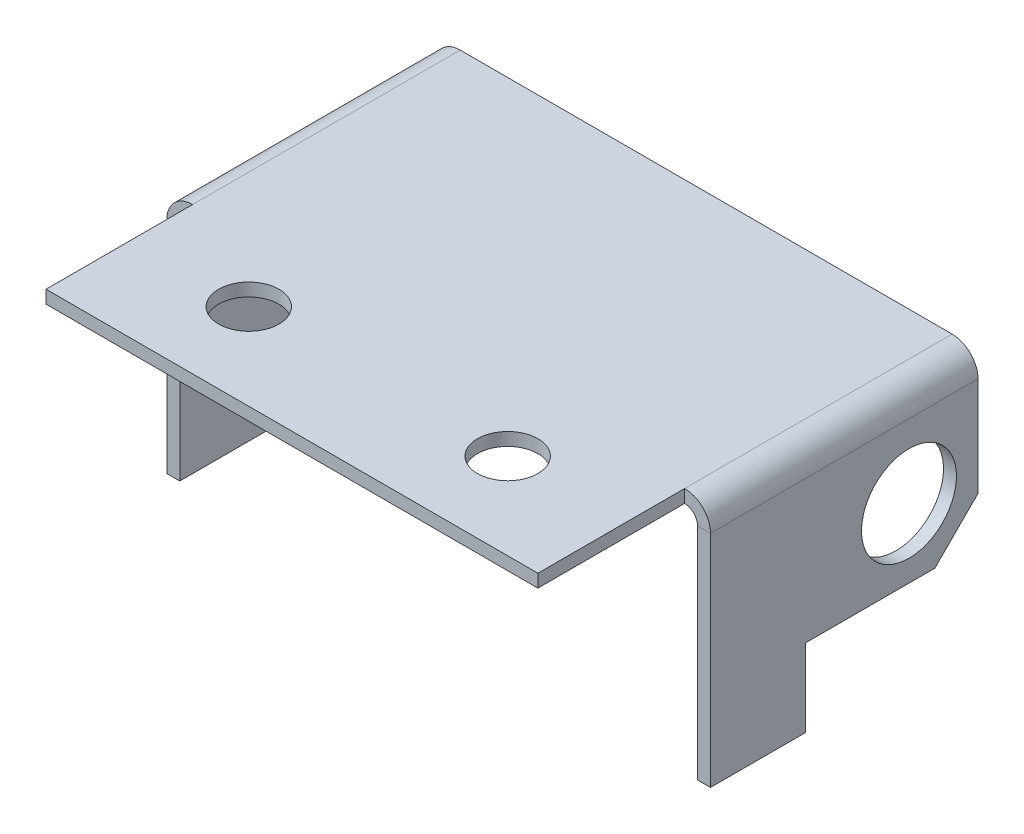
ISO-10303-21;
HEADER;
FILE_DESCRIPTION(('STEP AP214'),'2;1');
FILE_NAME('part.step','',(''),(''),'','','');
FILE_SCHEMA(('AUTOMOTIVE_DESIGN { 1 0 10303 214 1 1 1 1 }'));
ENDSEC;
DATA;
#1=APPLICATION_CONTEXT('core data for automotive mechanical design processes');
#2=APPLICATION_PROTOCOL_DEFINITION('international standard','automotive_design',2000,#1);
#3=PRODUCT_CONTEXT('',#1,'mechanical');
#4=PRODUCT('Part','Part','',(#3));
#5=PRODUCT_RELATED_PRODUCT_CATEGORY('part','',(#4));
#6=PRODUCT_DEFINITION_FORMATION('','',#4);
#7=PRODUCT_DEFINITION_CONTEXT('part definition',#1,'design');
#8=PRODUCT_DEFINITION('design','',#6,#7);
#9=PRODUCT_DEFINITION_SHAPE('','',#8);
#10=(LENGTH_UNIT() NAMED_UNIT(*) SI_UNIT(.MILLI.,.METRE.));
#11=(NAMED_UNIT(*) PLANE_ANGLE_UNIT() SI_UNIT($,.RADIAN.));
#12=(NAMED_UNIT(*) SI_UNIT($,.STERADIAN.) SOLID_ANGLE_UNIT());
#13=UNCERTAINTY_MEASURE_WITH_UNIT(LENGTH_MEASURE(1.E-05),#10,'distance_accuracy_value','');
#14=(GEOMETRIC_REPRESENTATION_CONTEXT(3) GLOBAL_UNCERTAINTY_ASSIGNED_CONTEXT((#13)) GLOBAL_UNIT_ASSIGNED_CONTEXT((#10,
#11,#12)) REPRESENTATION_CONTEXT('',''));
#15=CARTESIAN_POINT('',(0.,0.,0.));
#16=DIRECTION('',(0.,0.,1.));
#17=DIRECTION('',(1.,0.,0.));
#18=AXIS2_PLACEMENT_3D('',#15,#16,#17);
#19=CARTESIAN_POINT('',(-30.,-18.,15.5));
#20=DIRECTION('',(0.,-1.,0.));
#21=DIRECTION('',(0.,0.,-1.));
#22=AXIS2_PLACEMENT_3D('',#19,#20,#21);
#23=PLANE('',#22);
#24=DIRECTION('',(0.,0.,-1.));
#25=VECTOR('',#24,1.);
#26=CARTESIAN_POINT('',(-30.,-18.,15.5));
#27=LINE('',#26,#25);
#28=CARTESIAN_POINT('',(-30.,-18.,4.5));
#29=VERTEX_POINT('',#28);
#30=CARTESIAN_POINT('',(-30.,-18.,-10.5));
#31=VERTEX_POINT('',#30);
#32=EDGE_CURVE('E192',#29,#31,#27,.T.);
#33=ORIENTED_EDGE('',*,*,#32,.F.);
#34=DIRECTION('',(-1.,0.,0.));
#35=VECTOR('',#34,1.);
#36=CARTESIAN_POINT('',(-30.,-18.,4.5));
#37=LINE('',#36,#35);
#38=CARTESIAN_POINT('',(-31.5,-18.,4.5));
#39=VERTEX_POINT('',#38);
#40=EDGE_CURVE('E179',#29,#39,#37,.T.);
#41=ORIENTED_EDGE('',*,*,#40,.T.);
#42=DIRECTION('',(0.,0.,-1.));
#43=VECTOR('',#42,1.);
#44=CARTESIAN_POINT('',(-31.5,-18.,15.5));
#45=LINE('',#44,#43);
#46=CARTESIAN_POINT('',(-31.5,-18.,-10.5));
#47=VERTEX_POINT('',#46);
#48=EDGE_CURVE('E200',#39,#47,#45,.T.);
#49=ORIENTED_EDGE('',*,*,#48,.T.);
#50=DIRECTION('',(1.,0.,0.));
#51=VECTOR('',#50,1.);
#52=CARTESIAN_POINT('',(-30.,-18.,-10.5));
#53=LINE('',#52,#51);
#54=EDGE_CURVE('E198',#47,#31,#53,.T.);
#55=ORIENTED_EDGE('',*,*,#54,.T.);
#56=EDGE_LOOP('',(#33,#41,#49,#55));
#57=FACE_BOUND('',#56,.T.);
#58=ADVANCED_FACE('F45',(#57),#23,.T.);
#59=CARTESIAN_POINT('',(28.5,0.,15.5));
#60=DIRECTION('',(0.,0.,1.));
#61=DIRECTION('',(1.,0.,0.));
#62=AXIS2_PLACEMENT_3D('',#59,#60,#61);
#63=PLANE('',#62);
#64=DIRECTION('',(0.,1.,0.));
#65=VECTOR('',#64,1.);
#66=CARTESIAN_POINT('',(28.5,0.,15.5));
#67=LINE('',#66,#65);
#68=CARTESIAN_POINT('',(28.5,0.,15.5));
#69=VERTEX_POINT('',#68);
#70=CARTESIAN_POINT('',(28.5,1.5,15.5));
#71=VERTEX_POINT('',#70);
#72=EDGE_CURVE('E225',#69,#71,#67,.T.);
#73=ORIENTED_EDGE('',*,*,#72,.F.);
#74=CARTESIAN_POINT('',(28.5,-1.5,15.5));
#75=DIRECTION('',(0.,0.,-1.));
#76=DIRECTION('',(-1.,0.,0.));
#77=AXIS2_PLACEMENT_3D('',#74,#75,#76);
#78=CIRCLE('',#77,1.5);
#79=CARTESIAN_POINT('',(30.,-1.5,15.5));
#80=VERTEX_POINT('',#79);
#81=EDGE_CURVE('E341',#80,#69,#78,.F.);
#82=ORIENTED_EDGE('',*,*,#81,.F.);
#83=DIRECTION('',(-1.,0.,0.));
#84=VECTOR('',#83,1.);
#85=CARTESIAN_POINT('',(31.5,-1.5,15.5));
#86=LINE('',#85,#84);
#87=CARTESIAN_POINT('',(31.5,-1.5,15.5));
#88=VERTEX_POINT('',#87);
#89=EDGE_CURVE('E223',#88,#80,#86,.T.);
#90=ORIENTED_EDGE('',*,*,#89,.F.);
#91=CARTESIAN_POINT('',(28.5,-1.5,15.5));
#92=DIRECTION('',(0.,0.,1.));
#93=DIRECTION('',(1.,0.,0.));
#94=AXIS2_PLACEMENT_3D('',#91,#92,#93);
#95=CIRCLE('',#94,3.);
#96=EDGE_CURVE('E333',#88,#71,#95,.T.);
#97=ORIENTED_EDGE('',*,*,#96,.T.);
#98=EDGE_LOOP('',(#73,#82,#90,#97));
#99=FACE_BOUND('',#98,.T.);
#100=ADVANCED_FACE('F456',(#99),#63,.T.);
#101=CARTESIAN_POINT('',(30.,-1.5,-15.5));
#102=DIRECTION('',(0.,0.,-1.));
#103=DIRECTION('',(-1.,0.,0.));
#104=AXIS2_PLACEMENT_3D('',#101,#102,#103);
#105=PLANE('',#104);
#106=DIRECTION('',(1.,0.,0.));
#107=VECTOR('',#106,1.);
#108=CARTESIAN_POINT('',(30.,-1.5,-15.5));
#109=LINE('',#108,#107);
#110=CARTESIAN_POINT('',(30.,-1.5,-15.5));
#111=VERTEX_POINT('',#110);
#112=CARTESIAN_POINT('',(31.5,-1.5,-15.5));
#113=VERTEX_POINT('',#112);
#114=EDGE_CURVE('E220',#111,#113,#109,.T.);
#115=ORIENTED_EDGE('',*,*,#114,.F.);
#116=CARTESIAN_POINT('',(28.5,-1.5,-15.5));
#117=DIRECTION('',(0.,0.,-1.));
#118=DIRECTION('',(-1.,0.,0.));
#119=AXIS2_PLACEMENT_3D('',#116,#117,#118);
#120=CIRCLE('',#119,1.5);
#121=CARTESIAN_POINT('',(28.5,0.,-15.5));
#122=VERTEX_POINT('',#121);
#123=EDGE_CURVE('E267',#111,#122,#120,.F.);
#124=ORIENTED_EDGE('',*,*,#123,.T.);
#125=DIRECTION('',(0.,-1.,0.));
#126=VECTOR('',#125,1.);
#127=CARTESIAN_POINT('',(28.5,1.5,-15.5));
#128=LINE('',#127,#126);
#129=CARTESIAN_POINT('',(28.5,1.5,-15.5));
#130=VERTEX_POINT('',#129);
#131=EDGE_CURVE('E218',#130,#122,#128,.T.);
#132=ORIENTED_EDGE('',*,*,#131,.F.);
#133=CARTESIAN_POINT('',(28.5,-1.5,-15.5));
#134=DIRECTION('',(0.,0.,1.));
#135=DIRECTION('',(1.,0.,0.));
#136=AXIS2_PLACEMENT_3D('',#133,#134,#135);
#137=CIRCLE('',#136,3.);
#138=EDGE_CURVE('E261',#113,#130,#137,.T.);
#139=ORIENTED_EDGE('',*,*,#138,.F.);
#140=EDGE_LOOP('',(#115,#124,#132,#139));
#141=FACE_BOUND('',#140,.T.);
#142=ADVANCED_FACE('F473',(#141),#105,.T.);
#143=CARTESIAN_POINT('',(28.5,1.5,-15.5));
#144=DIRECTION('',(0.,0.,-1.));
#145=DIRECTION('',(-1.,0.,0.));
#146=AXIS2_PLACEMENT_3D('',#143,#144,#145);
#147=PLANE('',#146);
#148=DIRECTION('',(0.,1.,0.));
#149=VECTOR('',#148,1.);
#150=CARTESIAN_POINT('',(31.5,0.,-15.5));
#151=LINE('',#150,#149);
#152=CARTESIAN_POINT('',(31.5,-13.,-15.5));
#153=VERTEX_POINT('',#152);
#154=EDGE_CURVE('E254',#153,#113,#151,.T.);
#155=ORIENTED_EDGE('',*,*,#154,.F.);
#156=DIRECTION('',(-1.,0.,0.));
#157=VECTOR('',#156,1.);
#158=CARTESIAN_POINT('',(28.5,-13.,-15.5));
#159=LINE('',#158,#157);
#160=CARTESIAN_POINT('',(30.,-13.,-15.5));
#161=VERTEX_POINT('',#160);
#162=EDGE_CURVE('E237',#153,#161,#159,.T.);
#163=ORIENTED_EDGE('',*,*,#162,.T.);
#164=DIRECTION('',(0.,1.,0.));
#165=VECTOR('',#164,1.);
#166=CARTESIAN_POINT('',(30.,0.,-15.5));
#167=LINE('',#166,#165);
#168=EDGE_CURVE('E262',#161,#111,#167,.T.);
#169=ORIENTED_EDGE('',*,*,#168,.T.);
#170=ORIENTED_EDGE('',*,*,#114,.T.);
#171=EDGE_LOOP('',(#155,#163,#169,#170));
#172=FACE_BOUND('',#171,.T.);
#173=ADVANCED_FACE('F257',(#172),#147,.T.);
#174=CARTESIAN_POINT('',(-30.,-1.5,15.5));
#175=DIRECTION('',(0.,0.,1.));
#176=DIRECTION('',(1.,0.,0.));
#177=AXIS2_PLACEMENT_3D('',#174,#175,#176);
#178=PLANE('',#177);
#179=DIRECTION('',(-1.,0.,0.));
#180=VECTOR('',#179,1.);
#181=CARTESIAN_POINT('',(-30.,-1.5,15.5));
#182=LINE('',#181,#180);
#183=CARTESIAN_POINT('',(-30.,-1.5,15.5));
#184=VERTEX_POINT('',#183);
#185=CARTESIAN_POINT('',(-31.5,-1.5,15.5));
#186=VERTEX_POINT('',#185);
#187=EDGE_CURVE('E216',#184,#186,#182,.T.);
#188=ORIENTED_EDGE('',*,*,#187,.F.);
#189=CARTESIAN_POINT('',(-28.5,-1.5,15.5));
#190=DIRECTION('',(0.,0.,-1.));
#191=DIRECTION('',(-1.,0.,0.));
#192=AXIS2_PLACEMENT_3D('',#189,#190,#191);
#193=CIRCLE('',#192,1.5);
#194=CARTESIAN_POINT('',(-28.5,0.,15.5));
#195=VERTEX_POINT('',#194);
#196=EDGE_CURVE('E344',#195,#184,#193,.F.);
#197=ORIENTED_EDGE('',*,*,#196,.F.);
#198=DIRECTION('',(0.,-1.,0.));
#199=VECTOR('',#198,1.);
#200=CARTESIAN_POINT('',(-28.5,1.5,15.5));
#201=LINE('',#200,#199);
#202=CARTESIAN_POINT('',(-28.5,1.5,15.5));
#203=VERTEX_POINT('',#202);
#204=EDGE_CURVE('E213',#203,#195,#201,.T.);
#205=ORIENTED_EDGE('',*,*,#204,.F.);
#206=CARTESIAN_POINT('',(-28.5,-1.5,15.5));
#207=DIRECTION('',(0.,0.,1.));
#208=DIRECTION('',(1.,0.,0.));
#209=AXIS2_PLACEMENT_3D('',#206,#207,#208);
#210=CIRCLE('',#209,3.);
#211=EDGE_CURVE('E281',#203,#186,#210,.T.);
#212=ORIENTED_EDGE('',*,*,#211,.T.);
#213=EDGE_LOOP('',(#188,#197,#205,#212));
#214=FACE_BOUND('',#213,.T.);
#215=ADVANCED_FACE('F440',(#214),#178,.T.);
#216=CARTESIAN_POINT('',(-28.5,1.5,15.5));
#217=DIRECTION('',(0.,0.,1.));
#218=DIRECTION('',(1.,0.,0.));
#219=AXIS2_PLACEMENT_3D('',#216,#217,#218);
#220=PLANE('',#219);
#221=DIRECTION('',(0.,-1.,0.));
#222=VECTOR('',#221,1.);
#223=CARTESIAN_POINT('',(-30.,0.,15.5));
#224=LINE('',#223,#222);
#225=CARTESIAN_POINT('',(-30.,-27.,15.5));
#226=VERTEX_POINT('',#225);
#227=EDGE_CURVE('E346',#184,#226,#224,.T.);
#228=ORIENTED_EDGE('',*,*,#227,.F.);
#229=ORIENTED_EDGE('',*,*,#187,.T.);
#230=DIRECTION('',(0.,1.,0.));
#231=VECTOR('',#230,1.);
#232=CARTESIAN_POINT('',(-31.5,0.,15.5));
#233=LINE('',#232,#231);
#234=CARTESIAN_POINT('',(-31.5,-27.,15.5));
#235=VERTEX_POINT('',#234);
#236=EDGE_CURVE('E276',#186,#235,#233,.F.);
#237=ORIENTED_EDGE('',*,*,#236,.T.);
#238=DIRECTION('',(-1.,0.,0.));
#239=VECTOR('',#238,1.);
#240=CARTESIAN_POINT('',(-30.,-27.,15.5));
#241=LINE('',#240,#239);
#242=EDGE_CURVE('E405',#226,#235,#241,.T.);
#243=ORIENTED_EDGE('',*,*,#242,.F.);
#244=EDGE_LOOP('',(#228,#229,#237,#243));
#245=FACE_BOUND('',#244,.T.);
#246=ADVANCED_FACE('F437',(#245),#220,.T.);
#247=CARTESIAN_POINT('',(-28.5,0.,-15.5));
#248=DIRECTION('',(0.,0.,-1.));
#249=DIRECTION('',(-1.,0.,0.));
#250=AXIS2_PLACEMENT_3D('',#247,#248,#249);
#251=PLANE('',#250);
#252=DIRECTION('',(0.,1.,0.));
#253=VECTOR('',#252,1.);
#254=CARTESIAN_POINT('',(-28.5,0.,-15.5));
#255=LINE('',#254,#253);
#256=CARTESIAN_POINT('',(-28.5,0.,-15.5));
#257=VERTEX_POINT('',#256);
#258=CARTESIAN_POINT('',(-28.5,1.5,-15.5));
#259=VERTEX_POINT('',#258);
#260=EDGE_CURVE('E211',#257,#259,#255,.T.);
#261=ORIENTED_EDGE('',*,*,#260,.F.);
#262=CARTESIAN_POINT('',(-28.5,-1.5,-15.5));
#263=DIRECTION('',(0.,0.,-1.));
#264=DIRECTION('',(-1.,0.,0.));
#265=AXIS2_PLACEMENT_3D('',#262,#263,#264);
#266=CIRCLE('',#265,1.5);
#267=CARTESIAN_POINT('',(-30.,-1.5,-15.5));
#268=VERTEX_POINT('',#267);
#269=EDGE_CURVE('E313',#257,#268,#266,.F.);
#270=ORIENTED_EDGE('',*,*,#269,.T.);
#271=DIRECTION('',(1.,0.,0.));
#272=VECTOR('',#271,1.);
#273=CARTESIAN_POINT('',(-31.5,-1.5,-15.5));
#274=LINE('',#273,#272);
#275=CARTESIAN_POINT('',(-31.5,-1.5,-15.5));
#276=VERTEX_POINT('',#275);
#277=EDGE_CURVE('E203',#276,#268,#274,.T.);
#278=ORIENTED_EDGE('',*,*,#277,.F.);
#279=CARTESIAN_POINT('',(-28.5,-1.5,-15.5));
#280=DIRECTION('',(0.,0.,1.));
#281=DIRECTION('',(1.,0.,0.));
#282=AXIS2_PLACEMENT_3D('',#279,#280,#281);
#283=CIRCLE('',#282,3.);
#284=EDGE_CURVE('E273',#259,#276,#283,.T.);
#285=ORIENTED_EDGE('',*,*,#284,.F.);
#286=EDGE_LOOP('',(#261,#270,#278,#285));
#287=FACE_BOUND('',#286,.T.);
#288=ADVANCED_FACE('F430',(#287),#251,.T.);
#289=CARTESIAN_POINT('',(-31.5,-1.5,-15.5));
#290=DIRECTION('',(0.,0.,-1.));
#291=DIRECTION('',(-1.,0.,0.));
#292=AXIS2_PLACEMENT_3D('',#289,#290,#291);
#293=PLANE('',#292);
#294=DIRECTION('',(-1.,0.,0.));
#295=VECTOR('',#294,1.);
#296=CARTESIAN_POINT('',(-30.,0.,-15.5));
#297=LINE('',#296,#295);
#298=EDGE_CURVE('E304',#122,#257,#297,.T.);
#299=ORIENTED_EDGE('',*,*,#298,.T.);
#300=ORIENTED_EDGE('',*,*,#260,.T.);
#301=DIRECTION('',(1.,0.,0.));
#302=VECTOR('',#301,1.);
#303=CARTESIAN_POINT('',(-30.,1.5,-15.5));
#304=LINE('',#303,#302);
#305=EDGE_CURVE('E265',#130,#259,#304,.F.);
#306=ORIENTED_EDGE('',*,*,#305,.F.);
#307=ORIENTED_EDGE('',*,*,#131,.T.);
#308=EDGE_LOOP('',(#299,#300,#306,#307));
#309=FACE_BOUND('',#308,.T.);
#310=ADVANCED_FACE('F321',(#309),#293,.T.);
#311=CARTESIAN_POINT('',(-31.5,0.,15.5));
#312=DIRECTION('',(1.,0.,0.));
#313=DIRECTION('',(0.,0.,-1.));
#314=AXIS2_PLACEMENT_3D('',#311,#312,#313);
#315=PLANE('',#314);
#316=CARTESIAN_POINT('',(-31.5,-10.,-7.5));
#317=DIRECTION('',(-1.,0.,0.));
#318=DIRECTION('',(0.,0.,1.));
#319=AXIS2_PLACEMENT_3D('',#316,#317,#318);
#320=CIRCLE('',#319,5.5);
#321=CARTESIAN_POINT('',(-31.5,-10.,-2.));
#322=VERTEX_POINT('',#321);
#323=EDGE_CURVE('E355',#322,#322,#320,.T.);
#324=ORIENTED_EDGE('',*,*,#323,.F.);
#325=EDGE_LOOP('',(#324));
#326=FACE_BOUND('',#325,.T.);
#327=DIRECTION('',(0.,1.,0.));
#328=VECTOR('',#327,1.);
#329=CARTESIAN_POINT('',(-31.5,0.,-15.5));
#330=LINE('',#329,#328);
#331=CARTESIAN_POINT('',(-31.5,-13.,-15.5));
#332=VERTEX_POINT('',#331);
#333=EDGE_CURVE('E327',#276,#332,#330,.F.);
#334=ORIENTED_EDGE('',*,*,#333,.T.);
#335=DIRECTION('',(0.,0.707106781186548,-0.707106781186548));
#336=VECTOR('',#335,1.);
#337=CARTESIAN_POINT('',(-31.5,-13.,-15.5));
#338=LINE('',#337,#336);
#339=EDGE_CURVE('E231',#332,#47,#338,.F.);
#340=ORIENTED_EDGE('',*,*,#339,.T.);
#341=ORIENTED_EDGE('',*,*,#48,.F.);
#342=DIRECTION('',(0.,-1.,0.));
#343=VECTOR('',#342,1.);
#344=CARTESIAN_POINT('',(-31.5,-18.,4.5));
#345=LINE('',#344,#343);
#346=CARTESIAN_POINT('',(-31.5,-27.,4.5));
#347=VERTEX_POINT('',#346);
#348=EDGE_CURVE('E60',#39,#347,#345,.T.);
#349=ORIENTED_EDGE('',*,*,#348,.T.);
#350=DIRECTION('',(0.,0.,1.));
#351=VECTOR('',#350,1.);
#352=CARTESIAN_POINT('',(-31.5,-27.,15.5));
#353=LINE('',#352,#351);
#354=EDGE_CURVE('E195',#347,#235,#353,.T.);
#355=ORIENTED_EDGE('',*,*,#354,.T.);
#356=ORIENTED_EDGE('',*,*,#236,.F.);
#357=DIRECTION('',(0.,0.,-1.));
#358=VECTOR('',#357,1.);
#359=CARTESIAN_POINT('',(-31.5,-1.5,15.5));
#360=LINE('',#359,#358);
#361=EDGE_CURVE('E277',#186,#276,#360,.T.);
#362=ORIENTED_EDGE('',*,*,#361,.T.);
#363=EDGE_LOOP('',(#334,#340,#341,#349,#355,#356,#362));
#364=FACE_BOUND('',#363,.T.);
#365=ADVANCED_FACE('F421',(#326,#364),#315,.F.);
#366=CARTESIAN_POINT('',(-30.,0.,15.5));
#367=DIRECTION('',(1.,0.,0.));
#368=DIRECTION('',(0.,0.,-1.));
#369=AXIS2_PLACEMENT_3D('',#366,#367,#368);
#370=PLANE('',#369);
#371=CARTESIAN_POINT('',(-30.,-10.,-7.5));
#372=DIRECTION('',(1.,0.,0.));
#373=DIRECTION('',(0.,0.,-1.));
#374=AXIS2_PLACEMENT_3D('',#371,#372,#373);
#375=CIRCLE('',#374,5.5);
#376=CARTESIAN_POINT('',(-30.,-10.,-13.));
#377=VERTEX_POINT('',#376);
#378=EDGE_CURVE('E330',#377,#377,#375,.T.);
#379=ORIENTED_EDGE('',*,*,#378,.F.);
#380=EDGE_LOOP('',(#379));
#381=FACE_BOUND('',#380,.T.);
#382=ORIENTED_EDGE('',*,*,#227,.T.);
#383=DIRECTION('',(0.,0.,1.));
#384=VECTOR('',#383,1.);
#385=CARTESIAN_POINT('',(-30.,-27.,15.5));
#386=LINE('',#385,#384);
#387=CARTESIAN_POINT('',(-30.,-27.,4.5));
#388=VERTEX_POINT('',#387);
#389=EDGE_CURVE('E188',#388,#226,#386,.T.);
#390=ORIENTED_EDGE('',*,*,#389,.F.);
#391=DIRECTION('',(0.,-1.,0.));
#392=VECTOR('',#391,1.);
#393=CARTESIAN_POINT('',(-30.,-18.,4.5));
#394=LINE('',#393,#392);
#395=EDGE_CURVE('E182',#29,#388,#394,.T.);
#396=ORIENTED_EDGE('',*,*,#395,.F.);
#397=ORIENTED_EDGE('',*,*,#32,.T.);
#398=DIRECTION('',(0.,-0.707106781186548,0.707106781186548));
#399=VECTOR('',#398,1.);
#400=CARTESIAN_POINT('',(-30.,-22.,-6.49999999999998));
#401=LINE('',#400,#399);
#402=CARTESIAN_POINT('',(-30.,-13.,-15.5));
#403=VERTEX_POINT('',#402);
#404=EDGE_CURVE('E235',#31,#403,#401,.F.);
#405=ORIENTED_EDGE('',*,*,#404,.T.);
#406=DIRECTION('',(0.,-1.,0.));
#407=VECTOR('',#406,1.);
#408=CARTESIAN_POINT('',(-30.,0.,-15.5));
#409=LINE('',#408,#407);
#410=EDGE_CURVE('E318',#268,#403,#409,.T.);
#411=ORIENTED_EDGE('',*,*,#410,.F.);
#412=DIRECTION('',(0.,0.,-1.));
#413=VECTOR('',#412,1.);
#414=CARTESIAN_POINT('',(-30.,-1.5,15.5));
#415=LINE('',#414,#413);
#416=EDGE_CURVE('E201',#184,#268,#415,.T.);
#417=ORIENTED_EDGE('',*,*,#416,.F.);
#418=EDGE_LOOP('',(#382,#390,#396,#397,#405,#411,#417));
#419=FACE_BOUND('',#418,.T.);
#420=ADVANCED_FACE('F191',(#381,#419),#370,.T.);
#421=CARTESIAN_POINT('',(-28.5,-1.5,15.5));
#422=DIRECTION('',(0.,0.,-1.));
#423=DIRECTION('',(-1.,0.,0.));
#424=AXIS2_PLACEMENT_3D('',#421,#422,#423);
#425=CYLINDRICAL_SURFACE('',#424,1.5);
#426=ORIENTED_EDGE('',*,*,#269,.F.);
#427=DIRECTION('',(0.,0.,-1.));
#428=VECTOR('',#427,1.);
#429=CARTESIAN_POINT('',(-28.5,0.,15.5));
#430=LINE('',#429,#428);
#431=EDGE_CURVE('E206',#195,#257,#430,.T.);
#432=ORIENTED_EDGE('',*,*,#431,.F.);
#433=ORIENTED_EDGE('',*,*,#196,.T.);
#434=ORIENTED_EDGE('',*,*,#416,.T.);
#435=EDGE_LOOP('',(#426,#432,#433,#434));
#436=FACE_BOUND('',#435,.T.);
#437=ADVANCED_FACE('F314',(#436),#425,.F.);
#438=CARTESIAN_POINT('',(-30.,0.,15.5));
#439=DIRECTION('',(0.,-1.,0.));
#440=DIRECTION('',(0.,0.,-1.));
#441=AXIS2_PLACEMENT_3D('',#438,#439,#440);
#442=PLANE('',#441);
#443=CARTESIAN_POINT('',(-15.,0.,22.5));
#444=DIRECTION('',(0.,1.,0.));
#445=DIRECTION('',(0.,0.,1.));
#446=AXIS2_PLACEMENT_3D('',#443,#444,#445);
#447=CIRCLE('',#446,3.50000000000001);
#448=CARTESIAN_POINT('',(-15.,0.,26.));
#449=VERTEX_POINT('',#448);
#450=EDGE_CURVE('E375',#449,#449,#447,.T.);
#451=ORIENTED_EDGE('',*,*,#450,.T.);
#452=EDGE_LOOP('',(#451));
#453=FACE_BOUND('',#452,.T.);
#454=CARTESIAN_POINT('',(15.,0.,22.5));
#455=DIRECTION('',(0.,1.,0.));
#456=DIRECTION('',(0.,0.,-1.));
#457=AXIS2_PLACEMENT_3D('',#454,#455,#456);
#458=CIRCLE('',#457,3.5);
#459=CARTESIAN_POINT('',(15.,0.,19.));
#460=VERTEX_POINT('',#459);
#461=EDGE_CURVE('E384',#460,#460,#458,.T.);
#462=ORIENTED_EDGE('',*,*,#461,.T.);
#463=EDGE_LOOP('',(#462));
#464=FACE_BOUND('',#463,.T.);
#465=ORIENTED_EDGE('',*,*,#298,.F.);
#466=DIRECTION('',(0.,0.,-1.));
#467=VECTOR('',#466,1.);
#468=CARTESIAN_POINT('',(28.5,0.,15.5));
#469=LINE('',#468,#467);
#470=EDGE_CURVE('E294',#69,#122,#469,.T.);
#471=ORIENTED_EDGE('',*,*,#470,.F.);
#472=DIRECTION('',(0.,0.,-1.));
#473=VECTOR('',#472,1.);
#474=CARTESIAN_POINT('',(28.5,0.,15.5));
#475=LINE('',#474,#473);
#476=CARTESIAN_POINT('',(28.5,0.,32.5));
#477=VERTEX_POINT('',#476);
#478=EDGE_CURVE('E368',#477,#69,#475,.T.);
#479=ORIENTED_EDGE('',*,*,#478,.F.);
#480=DIRECTION('',(1.,0.,0.));
#481=VECTOR('',#480,1.);
#482=CARTESIAN_POINT('',(28.5,0.,32.5));
#483=LINE('',#482,#481);
#484=CARTESIAN_POINT('',(-28.5,0.,32.5));
#485=VERTEX_POINT('',#484);
#486=EDGE_CURVE('E363',#485,#477,#483,.T.);
#487=ORIENTED_EDGE('',*,*,#486,.F.);
#488=DIRECTION('',(0.,0.,1.));
#489=VECTOR('',#488,1.);
#490=CARTESIAN_POINT('',(-28.5,0.,15.5));
#491=LINE('',#490,#489);
#492=EDGE_CURVE('E308',#195,#485,#491,.T.);
#493=ORIENTED_EDGE('',*,*,#492,.F.);
#494=ORIENTED_EDGE('',*,*,#431,.T.);
#495=EDGE_LOOP('',(#465,#471,#479,#487,#493,#494));
#496=FACE_BOUND('',#495,.T.);
#497=ADVANCED_FACE('F301',(#453,#464,#496),#442,.T.);
#498=CARTESIAN_POINT('',(28.5,-1.5,15.5));
#499=DIRECTION('',(0.,0.,-1.));
#500=DIRECTION('',(-1.,0.,0.));
#501=AXIS2_PLACEMENT_3D('',#498,#499,#500);
#502=CYLINDRICAL_SURFACE('',#501,1.5);
#503=ORIENTED_EDGE('',*,*,#123,.F.);
#504=DIRECTION('',(0.,0.,-1.));
#505=VECTOR('',#504,1.);
#506=CARTESIAN_POINT('',(30.,-1.5,15.5));
#507=LINE('',#506,#505);
#508=EDGE_CURVE('E291',#80,#111,#507,.T.);
#509=ORIENTED_EDGE('',*,*,#508,.F.);
#510=ORIENTED_EDGE('',*,*,#81,.T.);
#511=ORIENTED_EDGE('',*,*,#470,.T.);
#512=EDGE_LOOP('',(#503,#509,#510,#511));
#513=FACE_BOUND('',#512,.T.);
#514=ADVANCED_FACE('F460',(#513),#502,.F.);
#515=CARTESIAN_POINT('',(30.,0.,15.5));
#516=DIRECTION('',(-1.,0.,0.));
#517=DIRECTION('',(0.,0.,1.));
#518=AXIS2_PLACEMENT_3D('',#515,#516,#517);
#519=PLANE('',#518);
#520=CARTESIAN_POINT('',(30.,-10.,-7.5));
#521=DIRECTION('',(-1.,0.,0.));
#522=DIRECTION('',(0.,0.,1.));
#523=AXIS2_PLACEMENT_3D('',#520,#521,#522);
#524=CIRCLE('',#523,5.5);
#525=CARTESIAN_POINT('',(30.,-10.,-2.));
#526=VERTEX_POINT('',#525);
#527=EDGE_CURVE('E351',#526,#526,#524,.T.);
#528=ORIENTED_EDGE('',*,*,#527,.F.);
#529=EDGE_LOOP('',(#528));
#530=FACE_BOUND('',#529,.T.);
#531=ORIENTED_EDGE('',*,*,#168,.F.);
#532=DIRECTION('',(0.,0.707106781186548,-0.707106781186548));
#533=VECTOR('',#532,1.);
#534=CARTESIAN_POINT('',(30.,-22.,-6.49999999999998));
#535=LINE('',#534,#533);
#536=CARTESIAN_POINT('',(30.,-18.,-10.5));
#537=VERTEX_POINT('',#536);
#538=EDGE_CURVE('E240',#161,#537,#535,.F.);
#539=ORIENTED_EDGE('',*,*,#538,.T.);
#540=DIRECTION('',(0.,0.,-1.));
#541=VECTOR('',#540,1.);
#542=CARTESIAN_POINT('',(30.,-18.,15.5));
#543=LINE('',#542,#541);
#544=CARTESIAN_POINT('',(30.,-18.,4.5));
#545=VERTEX_POINT('',#544);
#546=EDGE_CURVE('E247',#545,#537,#543,.T.);
#547=ORIENTED_EDGE('',*,*,#546,.F.);
#548=DIRECTION('',(0.,1.,0.));
#549=VECTOR('',#548,1.);
#550=CARTESIAN_POINT('',(30.,-18.,4.5));
#551=LINE('',#550,#549);
#552=CARTESIAN_POINT('',(30.,-27.,4.5));
#553=VERTEX_POINT('',#552);
#554=EDGE_CURVE('E402',#553,#545,#551,.T.);
#555=ORIENTED_EDGE('',*,*,#554,.F.);
#556=DIRECTION('',(0.,0.,-1.));
#557=VECTOR('',#556,1.);
#558=CARTESIAN_POINT('',(30.,-27.,4.5));
#559=LINE('',#558,#557);
#560=CARTESIAN_POINT('',(30.,-27.,15.5));
#561=VERTEX_POINT('',#560);
#562=EDGE_CURVE('E395',#561,#553,#559,.T.);
#563=ORIENTED_EDGE('',*,*,#562,.F.);
#564=DIRECTION('',(0.,1.,0.));
#565=VECTOR('',#564,1.);
#566=CARTESIAN_POINT('',(30.,0.,15.5));
#567=LINE('',#566,#565);
#568=EDGE_CURVE('E338',#561,#80,#567,.T.);
#569=ORIENTED_EDGE('',*,*,#568,.T.);
#570=ORIENTED_EDGE('',*,*,#508,.T.);
#571=EDGE_LOOP('',(#531,#539,#547,#555,#563,#569,#570));
#572=FACE_BOUND('',#571,.T.);
#573=ADVANCED_FACE('F462',(#530,#572),#519,.T.);
#574=CARTESIAN_POINT('',(31.5,-18.,15.5));
#575=DIRECTION('',(0.,-1.,0.));
#576=DIRECTION('',(0.,0.,-1.));
#577=AXIS2_PLACEMENT_3D('',#574,#575,#576);
#578=PLANE('',#577);
#579=DIRECTION('',(1.,0.,0.));
#580=VECTOR('',#579,1.);
#581=CARTESIAN_POINT('',(30.,-18.,4.5));
#582=LINE('',#581,#580);
#583=CARTESIAN_POINT('',(31.5,-18.,4.5));
#584=VERTEX_POINT('',#583);
#585=EDGE_CURVE('E68',#545,#584,#582,.T.);
#586=ORIENTED_EDGE('',*,*,#585,.F.);
#587=ORIENTED_EDGE('',*,*,#546,.T.);
#588=DIRECTION('',(1.,0.,0.));
#589=VECTOR('',#588,1.);
#590=CARTESIAN_POINT('',(31.5,-18.,-10.5));
#591=LINE('',#590,#589);
#592=CARTESIAN_POINT('',(31.5,-18.,-10.5));
#593=VERTEX_POINT('',#592);
#594=EDGE_CURVE('E53',#537,#593,#591,.T.);
#595=ORIENTED_EDGE('',*,*,#594,.T.);
#596=DIRECTION('',(0.,0.,-1.));
#597=VECTOR('',#596,1.);
#598=CARTESIAN_POINT('',(31.5,-18.,15.5));
#599=LINE('',#598,#597);
#600=EDGE_CURVE('E246',#584,#593,#599,.T.);
#601=ORIENTED_EDGE('',*,*,#600,.F.);
#602=EDGE_LOOP('',(#586,#587,#595,#601));
#603=FACE_BOUND('',#602,.T.);
#604=ADVANCED_FACE('F245',(#603),#578,.T.);
#605=CARTESIAN_POINT('',(31.5,0.,15.5));
#606=DIRECTION('',(-1.,0.,0.));
#607=DIRECTION('',(0.,0.,1.));
#608=AXIS2_PLACEMENT_3D('',#605,#606,#607);
#609=PLANE('',#608);
#610=CARTESIAN_POINT('',(31.5,-10.,-7.5));
#611=DIRECTION('',(-1.,0.,0.));
#612=DIRECTION('',(0.,0.,1.));
#613=AXIS2_PLACEMENT_3D('',#610,#611,#612);
#614=CIRCLE('',#613,5.5);
#615=CARTESIAN_POINT('',(31.5,-10.,-2.));
#616=VERTEX_POINT('',#615);
#617=EDGE_CURVE('E354',#616,#616,#614,.T.);
#618=ORIENTED_EDGE('',*,*,#617,.T.);
#619=EDGE_LOOP('',(#618));
#620=FACE_BOUND('',#619,.T.);
#621=DIRECTION('',(0.,1.,0.));
#622=VECTOR('',#621,1.);
#623=CARTESIAN_POINT('',(31.5,0.,15.5));
#624=LINE('',#623,#622);
#625=CARTESIAN_POINT('',(31.5,-27.,15.5));
#626=VERTEX_POINT('',#625);
#627=EDGE_CURVE('E335',#626,#88,#624,.T.);
#628=ORIENTED_EDGE('',*,*,#627,.F.);
#629=DIRECTION('',(0.,0.,-1.));
#630=VECTOR('',#629,1.);
#631=CARTESIAN_POINT('',(31.5,-27.,4.5));
#632=LINE('',#631,#630);
#633=CARTESIAN_POINT('',(31.5,-27.,4.5));
#634=VERTEX_POINT('',#633);
#635=EDGE_CURVE('E399',#626,#634,#632,.T.);
#636=ORIENTED_EDGE('',*,*,#635,.T.);
#637=DIRECTION('',(0.,1.,0.));
#638=VECTOR('',#637,1.);
#639=CARTESIAN_POINT('',(31.5,-18.,4.5));
#640=LINE('',#639,#638);
#641=EDGE_CURVE('E403',#634,#584,#640,.T.);
#642=ORIENTED_EDGE('',*,*,#641,.T.);
#643=ORIENTED_EDGE('',*,*,#600,.T.);
#644=DIRECTION('',(0.,-0.707106781186548,0.707106781186548));
#645=VECTOR('',#644,1.);
#646=CARTESIAN_POINT('',(31.5,-13.,-15.5));
#647=LINE('',#646,#645);
#648=EDGE_CURVE('E11',#593,#153,#647,.F.);
#649=ORIENTED_EDGE('',*,*,#648,.T.);
#650=ORIENTED_EDGE('',*,*,#154,.T.);
#651=DIRECTION('',(0.,0.,-1.));
#652=VECTOR('',#651,1.);
#653=CARTESIAN_POINT('',(31.5,-1.5,15.5));
#654=LINE('',#653,#652);
#655=EDGE_CURVE('E287',#88,#113,#654,.T.);
#656=ORIENTED_EDGE('',*,*,#655,.F.);
#657=EDGE_LOOP('',(#628,#636,#642,#643,#649,#650,#656));
#658=FACE_BOUND('',#657,.T.);
#659=ADVANCED_FACE('F252',(#620,#658),#609,.F.);
#660=CARTESIAN_POINT('',(28.5,-1.5,15.5));
#661=DIRECTION('',(0.,0.,-1.));
#662=DIRECTION('',(-1.,0.,0.));
#663=AXIS2_PLACEMENT_3D('',#660,#661,#662);
#664=CYLINDRICAL_SURFACE('',#663,3.);
#665=ORIENTED_EDGE('',*,*,#138,.T.);
#666=DIRECTION('',(0.,0.,-1.));
#667=VECTOR('',#666,1.);
#668=CARTESIAN_POINT('',(28.5,1.5,15.5));
#669=LINE('',#668,#667);
#670=EDGE_CURVE('E284',#71,#130,#669,.T.);
#671=ORIENTED_EDGE('',*,*,#670,.F.);
#672=ORIENTED_EDGE('',*,*,#96,.F.);
#673=ORIENTED_EDGE('',*,*,#655,.T.);
#674=EDGE_LOOP('',(#665,#671,#672,#673));
#675=FACE_BOUND('',#674,.T.);
#676=ADVANCED_FACE('F449',(#675),#664,.T.);
#677=CARTESIAN_POINT('',(-30.,1.5,15.5));
#678=DIRECTION('',(0.,-1.,0.));
#679=DIRECTION('',(0.,0.,-1.));
#680=AXIS2_PLACEMENT_3D('',#677,#678,#679);
#681=PLANE('',#680);
#682=CARTESIAN_POINT('',(-15.,1.5,22.5));
#683=DIRECTION('',(0.,1.,0.));
#684=DIRECTION('',(0.,0.,1.));
#685=AXIS2_PLACEMENT_3D('',#682,#683,#684);
#686=CIRCLE('',#685,3.50000000000001);
#687=CARTESIAN_POINT('',(-15.,1.5,26.));
#688=VERTEX_POINT('',#687);
#689=EDGE_CURVE('E388',#688,#688,#686,.T.);
#690=ORIENTED_EDGE('',*,*,#689,.F.);
#691=EDGE_LOOP('',(#690));
#692=FACE_BOUND('',#691,.T.);
#693=CARTESIAN_POINT('',(15.,1.5,22.5));
#694=DIRECTION('',(0.,1.,0.));
#695=DIRECTION('',(0.,0.,-1.));
#696=AXIS2_PLACEMENT_3D('',#693,#694,#695);
#697=CIRCLE('',#696,3.5);
#698=CARTESIAN_POINT('',(15.,1.5,19.));
#699=VERTEX_POINT('',#698);
#700=EDGE_CURVE('E381',#699,#699,#697,.T.);
#701=ORIENTED_EDGE('',*,*,#700,.F.);
#702=EDGE_LOOP('',(#701));
#703=FACE_BOUND('',#702,.T.);
#704=ORIENTED_EDGE('',*,*,#305,.T.);
#705=DIRECTION('',(0.,0.,-1.));
#706=VECTOR('',#705,1.);
#707=CARTESIAN_POINT('',(-28.5,1.5,15.5));
#708=LINE('',#707,#706);
#709=EDGE_CURVE('E280',#203,#259,#708,.T.);
#710=ORIENTED_EDGE('',*,*,#709,.F.);
#711=DIRECTION('',(0.,0.,1.));
#712=VECTOR('',#711,1.);
#713=CARTESIAN_POINT('',(-28.5,1.5,15.5));
#714=LINE('',#713,#712);
#715=CARTESIAN_POINT('',(-28.5,1.5,32.5));
#716=VERTEX_POINT('',#715);
#717=EDGE_CURVE('E369',#203,#716,#714,.T.);
#718=ORIENTED_EDGE('',*,*,#717,.T.);
#719=DIRECTION('',(1.,0.,0.));
#720=VECTOR('',#719,1.);
#721=CARTESIAN_POINT('',(28.5,1.5,32.5));
#722=LINE('',#721,#720);
#723=CARTESIAN_POINT('',(28.5,1.5,32.5));
#724=VERTEX_POINT('',#723);
#725=EDGE_CURVE('E365',#716,#724,#722,.T.);
#726=ORIENTED_EDGE('',*,*,#725,.T.);
#727=DIRECTION('',(0.,0.,-1.));
#728=VECTOR('',#727,1.);
#729=CARTESIAN_POINT('',(28.5,1.5,15.5));
#730=LINE('',#729,#728);
#731=EDGE_CURVE('E372',#724,#71,#730,.T.);
#732=ORIENTED_EDGE('',*,*,#731,.T.);
#733=ORIENTED_EDGE('',*,*,#670,.T.);
#734=EDGE_LOOP('',(#704,#710,#718,#726,#732,#733));
#735=FACE_BOUND('',#734,.T.);
#736=ADVANCED_FACE('F443',(#692,#703,#735),#681,.F.);
#737=CARTESIAN_POINT('',(-28.5,-1.5,15.5));
#738=DIRECTION('',(0.,0.,-1.));
#739=DIRECTION('',(-1.,0.,0.));
#740=AXIS2_PLACEMENT_3D('',#737,#738,#739);
#741=CYLINDRICAL_SURFACE('',#740,3.);
#742=ORIENTED_EDGE('',*,*,#284,.T.);
#743=ORIENTED_EDGE('',*,*,#361,.F.);
#744=ORIENTED_EDGE('',*,*,#211,.F.);
#745=ORIENTED_EDGE('',*,*,#709,.T.);
#746=EDGE_LOOP('',(#742,#743,#744,#745));
#747=FACE_BOUND('',#746,.T.);
#748=ADVANCED_FACE('F433',(#747),#741,.T.);
#749=CARTESIAN_POINT('',(-28.5,-1.5,15.5));
#750=DIRECTION('',(0.,0.,-1.));
#751=DIRECTION('',(-1.,0.,0.));
#752=AXIS2_PLACEMENT_3D('',#749,#750,#751);
#753=PLANE('',#752);
#754=ORIENTED_EDGE('',*,*,#627,.T.);
#755=ORIENTED_EDGE('',*,*,#89,.T.);
#756=ORIENTED_EDGE('',*,*,#568,.F.);
#757=DIRECTION('',(1.,0.,0.));
#758=VECTOR('',#757,1.);
#759=CARTESIAN_POINT('',(30.,-27.,15.5));
#760=LINE('',#759,#758);
#761=EDGE_CURVE('E394',#561,#626,#760,.T.);
#762=ORIENTED_EDGE('',*,*,#761,.T.);
#763=EDGE_LOOP('',(#754,#755,#756,#762));
#764=FACE_BOUND('',#763,.T.);
#765=ADVANCED_FACE('F467',(#764),#753,.F.);
#766=CARTESIAN_POINT('',(-28.5,-1.5,-15.5));
#767=DIRECTION('',(0.,0.,-1.));
#768=DIRECTION('',(-1.,0.,0.));
#769=AXIS2_PLACEMENT_3D('',#766,#767,#768);
#770=PLANE('',#769);
#771=ORIENTED_EDGE('',*,*,#410,.T.);
#772=DIRECTION('',(-1.,0.,0.));
#773=VECTOR('',#772,1.);
#774=CARTESIAN_POINT('',(-28.5,-13.,-15.5));
#775=LINE('',#774,#773);
#776=EDGE_CURVE('E228',#403,#332,#775,.T.);
#777=ORIENTED_EDGE('',*,*,#776,.T.);
#778=ORIENTED_EDGE('',*,*,#333,.F.);
#779=ORIENTED_EDGE('',*,*,#277,.T.);
#780=EDGE_LOOP('',(#771,#777,#778,#779));
#781=FACE_BOUND('',#780,.T.);
#782=ADVANCED_FACE('F428',(#781),#770,.T.);
#783=CARTESIAN_POINT('',(-28.5,-13.,-15.5));
#784=DIRECTION('',(0.,0.707106781186547,0.707106781186547));
#785=DIRECTION('',(-1.,0.,0.));
#786=AXIS2_PLACEMENT_3D('',#783,#784,#785);
#787=PLANE('',#786);
#788=ORIENTED_EDGE('',*,*,#404,.F.);
#789=ORIENTED_EDGE('',*,*,#54,.F.);
#790=ORIENTED_EDGE('',*,*,#339,.F.);
#791=ORIENTED_EDGE('',*,*,#776,.F.);
#792=EDGE_LOOP('',(#788,#789,#790,#791));
#793=FACE_BOUND('',#792,.T.);
#794=ADVANCED_FACE('F426',(#793),#787,.F.);
#795=CARTESIAN_POINT('',(28.5,-13.,-15.5));
#796=DIRECTION('',(0.,0.707106781186547,0.707106781186547));
#797=DIRECTION('',(-1.,0.,0.));
#798=AXIS2_PLACEMENT_3D('',#795,#796,#797);
#799=PLANE('',#798);
#800=ORIENTED_EDGE('',*,*,#648,.F.);
#801=ORIENTED_EDGE('',*,*,#594,.F.);
#802=ORIENTED_EDGE('',*,*,#538,.F.);
#803=ORIENTED_EDGE('',*,*,#162,.F.);
#804=EDGE_LOOP('',(#800,#801,#802,#803));
#805=FACE_BOUND('',#804,.T.);
#806=ADVANCED_FACE('F47',(#805),#799,.F.);
#807=CARTESIAN_POINT('',(31.5,-10.,-7.5));
#808=DIRECTION('',(-1.,0.,0.));
#809=DIRECTION('',(0.,0.,1.));
#810=AXIS2_PLACEMENT_3D('',#807,#808,#809);
#811=CYLINDRICAL_SURFACE('',#810,5.5);
#812=ORIENTED_EDGE('',*,*,#527,.T.);
#813=EDGE_LOOP('',(#812));
#814=FACE_BOUND('',#813,.T.);
#815=ORIENTED_EDGE('',*,*,#617,.F.);
#816=EDGE_LOOP('',(#815));
#817=FACE_BOUND('',#816,.T.);
#818=ADVANCED_FACE('F714',(#814,#817),#811,.F.);
#819=ORIENTED_EDGE('',*,*,#378,.T.);
#820=EDGE_LOOP('',(#819));
#821=FACE_BOUND('',#820,.T.);
#822=ORIENTED_EDGE('',*,*,#323,.T.);
#823=EDGE_LOOP('',(#822));
#824=FACE_BOUND('',#823,.T.);
#825=ADVANCED_FACE('F540',(#821,#824),#811,.F.);
#826=CARTESIAN_POINT('',(28.5,0.,15.5));
#827=DIRECTION('',(1.,0.,0.));
#828=DIRECTION('',(0.,0.,-1.));
#829=AXIS2_PLACEMENT_3D('',#826,#827,#828);
#830=PLANE('',#829);
#831=ORIENTED_EDGE('',*,*,#731,.F.);
#832=DIRECTION('',(0.,1.,0.));
#833=VECTOR('',#832,1.);
#834=CARTESIAN_POINT('',(28.5,0.,32.5));
#835=LINE('',#834,#833);
#836=EDGE_CURVE('E358',#477,#724,#835,.T.);
#837=ORIENTED_EDGE('',*,*,#836,.F.);
#838=ORIENTED_EDGE('',*,*,#478,.T.);
#839=ORIENTED_EDGE('',*,*,#72,.T.);
#840=EDGE_LOOP('',(#831,#837,#838,#839));
#841=FACE_BOUND('',#840,.T.);
#842=ADVANCED_FACE('F452',(#841),#830,.T.);
#843=CARTESIAN_POINT('',(28.5,0.,32.5));
#844=DIRECTION('',(0.,0.,1.));
#845=DIRECTION('',(1.,0.,0.));
#846=AXIS2_PLACEMENT_3D('',#843,#844,#845);
#847=PLANE('',#846);
#848=ORIENTED_EDGE('',*,*,#725,.F.);
#849=DIRECTION('',(0.,1.,0.));
#850=VECTOR('',#849,1.);
#851=CARTESIAN_POINT('',(-28.5,0.,32.5));
#852=LINE('',#851,#850);
#853=EDGE_CURVE('E361',#485,#716,#852,.T.);
#854=ORIENTED_EDGE('',*,*,#853,.F.);
#855=ORIENTED_EDGE('',*,*,#486,.T.);
#856=ORIENTED_EDGE('',*,*,#836,.T.);
#857=EDGE_LOOP('',(#848,#854,#855,#856));
#858=FACE_BOUND('',#857,.T.);
#859=ADVANCED_FACE('F539',(#858),#847,.T.);
#860=CARTESIAN_POINT('',(-28.5,0.,15.5));
#861=DIRECTION('',(-1.,0.,0.));
#862=DIRECTION('',(0.,0.,1.));
#863=AXIS2_PLACEMENT_3D('',#860,#861,#862);
#864=PLANE('',#863);
#865=ORIENTED_EDGE('',*,*,#717,.F.);
#866=ORIENTED_EDGE('',*,*,#204,.T.);
#867=ORIENTED_EDGE('',*,*,#492,.T.);
#868=ORIENTED_EDGE('',*,*,#853,.T.);
#869=EDGE_LOOP('',(#865,#866,#867,#868));
#870=FACE_BOUND('',#869,.T.);
#871=ADVANCED_FACE('F549',(#870),#864,.T.);
#872=CARTESIAN_POINT('',(15.,0.,22.5));
#873=DIRECTION('',(0.,1.,0.));
#874=DIRECTION('',(0.,0.,1.));
#875=AXIS2_PLACEMENT_3D('',#872,#873,#874);
#876=CYLINDRICAL_SURFACE('',#875,3.5);
#877=ORIENTED_EDGE('',*,*,#461,.F.);
#878=EDGE_LOOP('',(#877));
#879=FACE_BOUND('',#878,.T.);
#880=ORIENTED_EDGE('',*,*,#700,.T.);
#881=EDGE_LOOP('',(#880));
#882=FACE_BOUND('',#881,.T.);
#883=ADVANCED_FACE('F558',(#879,#882),#876,.F.);
#884=CARTESIAN_POINT('',(-15.,0.,22.5));
#885=DIRECTION('',(0.,1.,0.));
#886=DIRECTION('',(0.,0.,1.));
#887=AXIS2_PLACEMENT_3D('',#884,#885,#886);
#888=CYLINDRICAL_SURFACE('',#887,3.50000000000001);
#889=ORIENTED_EDGE('',*,*,#450,.F.);
#890=EDGE_LOOP('',(#889));
#891=FACE_BOUND('',#890,.T.);
#892=ORIENTED_EDGE('',*,*,#689,.T.);
#893=EDGE_LOOP('',(#892));
#894=FACE_BOUND('',#893,.T.);
#895=ADVANCED_FACE('F581',(#891,#894),#888,.F.);
#896=CARTESIAN_POINT('',(30.,-18.,4.5));
#897=DIRECTION('',(0.,0.,-1.));
#898=DIRECTION('',(-1.,0.,0.));
#899=AXIS2_PLACEMENT_3D('',#896,#897,#898);
#900=PLANE('',#899);
#901=ORIENTED_EDGE('',*,*,#641,.F.);
#902=DIRECTION('',(1.,0.,0.));
#903=VECTOR('',#902,1.);
#904=CARTESIAN_POINT('',(30.,-27.,4.5));
#905=LINE('',#904,#903);
#906=EDGE_CURVE('E385',#553,#634,#905,.T.);
#907=ORIENTED_EDGE('',*,*,#906,.F.);
#908=ORIENTED_EDGE('',*,*,#554,.T.);
#909=ORIENTED_EDGE('',*,*,#585,.T.);
#910=EDGE_LOOP('',(#901,#907,#908,#909));
#911=FACE_BOUND('',#910,.T.);
#912=ADVANCED_FACE('F590',(#911),#900,.T.);
#913=CARTESIAN_POINT('',(30.,-27.,4.5));
#914=DIRECTION('',(0.,-1.,0.));
#915=DIRECTION('',(0.,0.,-1.));
#916=AXIS2_PLACEMENT_3D('',#913,#914,#915);
#917=PLANE('',#916);
#918=ORIENTED_EDGE('',*,*,#635,.F.);
#919=ORIENTED_EDGE('',*,*,#761,.F.);
#920=ORIENTED_EDGE('',*,*,#562,.T.);
#921=ORIENTED_EDGE('',*,*,#906,.T.);
#922=EDGE_LOOP('',(#918,#919,#920,#921));
#923=FACE_BOUND('',#922,.T.);
#924=ADVANCED_FACE('F470',(#923),#917,.T.);
#925=CARTESIAN_POINT('',(-30.,-27.,15.5));
#926=DIRECTION('',(0.,-1.,0.));
#927=DIRECTION('',(1.,0.,0.));
#928=AXIS2_PLACEMENT_3D('',#925,#926,#927);
#929=PLANE('',#928);
#930=ORIENTED_EDGE('',*,*,#354,.F.);
#931=DIRECTION('',(-1.,0.,0.));
#932=VECTOR('',#931,1.);
#933=CARTESIAN_POINT('',(-30.,-27.,4.5));
#934=LINE('',#933,#932);
#935=EDGE_CURVE('E187',#388,#347,#934,.T.);
#936=ORIENTED_EDGE('',*,*,#935,.F.);
#937=ORIENTED_EDGE('',*,*,#389,.T.);
#938=ORIENTED_EDGE('',*,*,#242,.T.);
#939=EDGE_LOOP('',(#930,#936,#937,#938));
#940=FACE_BOUND('',#939,.T.);
#941=ADVANCED_FACE('F418',(#940),#929,.T.);
#942=CARTESIAN_POINT('',(-30.,-18.,4.5));
#943=DIRECTION('',(0.,0.,-1.));
#944=DIRECTION('',(0.,1.,0.));
#945=AXIS2_PLACEMENT_3D('',#942,#943,#944);
#946=PLANE('',#945);
#947=ORIENTED_EDGE('',*,*,#348,.F.);
#948=ORIENTED_EDGE('',*,*,#40,.F.);
#949=ORIENTED_EDGE('',*,*,#395,.T.);
#950=ORIENTED_EDGE('',*,*,#935,.T.);
#951=EDGE_LOOP('',(#947,#948,#949,#950));
#952=FACE_BOUND('',#951,.T.);
#953=ADVANCED_FACE('F181',(#952),#946,.T.);
#954=CLOSED_SHELL('',(#58,#100,#142,#173,#215,#246,#288,#310,#365,#420,#437,#497,#514,#573,#604,
#659,#676,#736,#748,#765,#782,#794,#806,#818,#825,#842,#859,#871,#883,#895,#912,#924,#941,#953));
#955=MANIFOLD_SOLID_BREP('B2',#954);
#956=ADVANCED_BREP_SHAPE_REPRESENTATION('',(#18,#955),#14);
#957=SHAPE_DEFINITION_REPRESENTATION(#9,#956);
ENDSEC;
END-ISO-10303-21;
